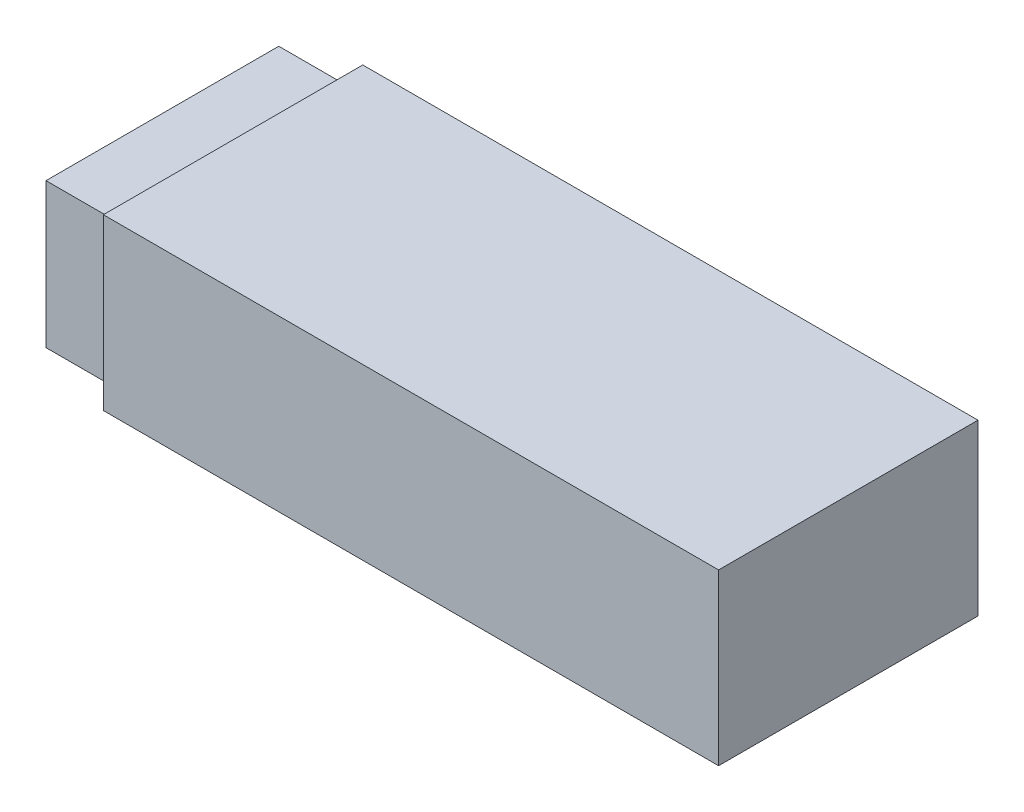
ISO-10303-21;
HEADER;
FILE_DESCRIPTION(('STEP AP214'),'2;1');
FILE_NAME('part.step','',(''),(''),'','','');
FILE_SCHEMA(('AUTOMOTIVE_DESIGN { 1 0 10303 214 1 1 1 1 }'));
ENDSEC;
DATA;
#1=APPLICATION_CONTEXT('core data for automotive mechanical design processes');
#2=APPLICATION_PROTOCOL_DEFINITION('international standard','automotive_design',2000,#1);
#3=PRODUCT_CONTEXT('',#1,'mechanical');
#4=PRODUCT('Part','Part','',(#3));
#5=PRODUCT_RELATED_PRODUCT_CATEGORY('part','',(#4));
#6=PRODUCT_DEFINITION_FORMATION('','',#4);
#7=PRODUCT_DEFINITION_CONTEXT('part definition',#1,'design');
#8=PRODUCT_DEFINITION('design','',#6,#7);
#9=PRODUCT_DEFINITION_SHAPE('','',#8);
#10=(LENGTH_UNIT() NAMED_UNIT(*) SI_UNIT(.MILLI.,.METRE.));
#11=(NAMED_UNIT(*) PLANE_ANGLE_UNIT() SI_UNIT($,.RADIAN.));
#12=(NAMED_UNIT(*) SI_UNIT($,.STERADIAN.) SOLID_ANGLE_UNIT());
#13=UNCERTAINTY_MEASURE_WITH_UNIT(LENGTH_MEASURE(1.E-05),#10,'distance_accuracy_value','');
#14=(GEOMETRIC_REPRESENTATION_CONTEXT(3) GLOBAL_UNCERTAINTY_ASSIGNED_CONTEXT((#13)) GLOBAL_UNIT_ASSIGNED_CONTEXT((#10,
#11,#12)) REPRESENTATION_CONTEXT('',''));
#15=CARTESIAN_POINT('',(0.,0.,0.));
#16=DIRECTION('',(0.,0.,1.));
#17=DIRECTION('',(1.,0.,0.));
#18=AXIS2_PLACEMENT_3D('',#15,#16,#17);
#19=CARTESIAN_POINT('',(57.2304529306441,5.10219609198077,217.892271057495));
#20=DIRECTION('',(0.,-1.,0.));
#21=DIRECTION('',(1.,0.,0.));
#22=AXIS2_PLACEMENT_3D('',#19,#20,#21);
#23=PLANE('',#22);
#24=DIRECTION('',(-1.,0.,0.));
#25=VECTOR('',#24,1.);
#26=CARTESIAN_POINT('',(57.2304529306441,5.10219609198077,202.292271057495));
#27=LINE('',#26,#25);
#28=CARTESIAN_POINT('',(57.2304529306441,5.10219609198077,202.292271057495));
#29=VERTEX_POINT('',#28);
#30=CARTESIAN_POINT('',(20.2304529306441,5.10219609198091,202.292271057495));
#31=VERTEX_POINT('',#30);
#32=EDGE_CURVE('E11',#29,#31,#27,.T.);
#33=ORIENTED_EDGE('',*,*,#32,.T.);
#34=DIRECTION('',(0.,0.,-1.));
#35=VECTOR('',#34,1.);
#36=CARTESIAN_POINT('',(20.2304529306441,5.10219609198091,217.892271057495));
#37=LINE('',#36,#35);
#38=CARTESIAN_POINT('',(20.2304529306441,5.10219609198091,217.892271057495));
#39=VERTEX_POINT('',#38);
#40=EDGE_CURVE('E36',#39,#31,#37,.T.);
#41=ORIENTED_EDGE('',*,*,#40,.F.);
#42=DIRECTION('',(-1.,0.,0.));
#43=VECTOR('',#42,1.);
#44=CARTESIAN_POINT('',(57.2304529306441,5.10219609198077,217.892271057495));
#45=LINE('',#44,#43);
#46=CARTESIAN_POINT('',(57.2304529306441,5.10219609198077,217.892271057495));
#47=VERTEX_POINT('',#46);
#48=EDGE_CURVE('E125',#47,#39,#45,.T.);
#49=ORIENTED_EDGE('',*,*,#48,.F.);
#50=DIRECTION('',(0.,0.,-1.));
#51=VECTOR('',#50,1.);
#52=CARTESIAN_POINT('',(57.2304529306441,5.10219609198077,217.892271057495));
#53=LINE('',#52,#51);
#54=EDGE_CURVE('E27',#47,#29,#53,.T.);
#55=ORIENTED_EDGE('',*,*,#54,.T.);
#56=EDGE_LOOP('',(#33,#41,#49,#55));
#57=FACE_BOUND('',#56,.T.);
#58=ADVANCED_FACE('F17',(#57),#23,.F.);
#59=CARTESIAN_POINT('',(20.2304529306441,5.10219609198077,217.892271057495));
#60=DIRECTION('',(1.,0.,0.));
#61=DIRECTION('',(0.,0.,1.));
#62=AXIS2_PLACEMENT_3D('',#59,#60,#61);
#63=PLANE('',#62);
#64=DIRECTION('',(0.,0.,-1.));
#65=VECTOR('',#64,1.);
#66=CARTESIAN_POINT('',(20.2304529306441,4.35219609198091,217.892271057495));
#67=LINE('',#66,#65);
#68=CARTESIAN_POINT('',(20.2304529306441,4.35219609198091,217.092271057495));
#69=VERTEX_POINT('',#68);
#70=CARTESIAN_POINT('',(20.2304529306441,4.35219609198092,203.092271057495));
#71=VERTEX_POINT('',#70);
#72=EDGE_CURVE('E111',#69,#71,#67,.T.);
#73=ORIENTED_EDGE('',*,*,#72,.F.);
#74=DIRECTION('',(0.,-1.,0.));
#75=VECTOR('',#74,1.);
#76=CARTESIAN_POINT('',(20.2304529306441,5.10219609198077,217.092271057495));
#77=LINE('',#76,#75);
#78=CARTESIAN_POINT('',(20.2304529306441,-4.34780390801909,217.092271057495));
#79=VERTEX_POINT('',#78);
#80=EDGE_CURVE('E133',#69,#79,#77,.T.);
#81=ORIENTED_EDGE('',*,*,#80,.T.);
#82=DIRECTION('',(0.,0.,1.));
#83=VECTOR('',#82,1.);
#84=CARTESIAN_POINT('',(20.2304529306441,-4.34780390801909,217.892271057495));
#85=LINE('',#84,#83);
#86=CARTESIAN_POINT('',(20.2304529306441,-4.34780390801909,203.092271057495));
#87=VERTEX_POINT('',#86);
#88=EDGE_CURVE('E86',#87,#79,#85,.T.);
#89=ORIENTED_EDGE('',*,*,#88,.F.);
#90=DIRECTION('',(0.,-1.,0.));
#91=VECTOR('',#90,1.);
#92=CARTESIAN_POINT('',(20.2304529306441,5.10219609198077,203.092271057495));
#93=LINE('',#92,#91);
#94=EDGE_CURVE('E92',#71,#87,#93,.T.);
#95=ORIENTED_EDGE('',*,*,#94,.F.);
#96=EDGE_LOOP('',(#73,#81,#89,#95));
#97=FACE_BOUND('',#96,.T.);
#98=DIRECTION('',(0.,-1.,0.));
#99=VECTOR('',#98,1.);
#100=CARTESIAN_POINT('',(20.2304529306441,5.10219609198077,202.292271057495));
#101=LINE('',#100,#99);
#102=CARTESIAN_POINT('',(20.2304529306441,-5.09780390801923,202.292271057495));
#103=VERTEX_POINT('',#102);
#104=EDGE_CURVE('E131',#31,#103,#101,.T.);
#105=ORIENTED_EDGE('',*,*,#104,.T.);
#106=DIRECTION('',(0.,0.,-1.));
#107=VECTOR('',#106,1.);
#108=CARTESIAN_POINT('',(20.2304529306441,-5.09780390801923,217.892271057495));
#109=LINE('',#108,#107);
#110=CARTESIAN_POINT('',(20.2304529306441,-5.09780390801923,217.892271057495));
#111=VERTEX_POINT('',#110);
#112=EDGE_CURVE('E120',#111,#103,#109,.T.);
#113=ORIENTED_EDGE('',*,*,#112,.F.);
#114=DIRECTION('',(0.,-1.,0.));
#115=VECTOR('',#114,1.);
#116=CARTESIAN_POINT('',(20.2304529306441,5.10219609198077,217.892271057495));
#117=LINE('',#116,#115);
#118=EDGE_CURVE('E123',#39,#111,#117,.T.);
#119=ORIENTED_EDGE('',*,*,#118,.F.);
#120=ORIENTED_EDGE('',*,*,#40,.T.);
#121=EDGE_LOOP('',(#105,#113,#119,#120));
#122=FACE_BOUND('',#121,.T.);
#123=ADVANCED_FACE('F150',(#97,#122),#63,.F.);
#124=CARTESIAN_POINT('',(20.2304529306441,-5.09780390801909,217.892271057495));
#125=DIRECTION('',(0.,1.,0.));
#126=DIRECTION('',(-1.,0.,0.));
#127=AXIS2_PLACEMENT_3D('',#124,#125,#126);
#128=PLANE('',#127);
#129=DIRECTION('',(1.,0.,0.));
#130=VECTOR('',#129,1.);
#131=CARTESIAN_POINT('',(20.2304529306441,-5.09780390801909,202.292271057495));
#132=LINE('',#131,#130);
#133=CARTESIAN_POINT('',(57.2304529306441,-5.09780390801923,202.292271057495));
#134=VERTEX_POINT('',#133);
#135=EDGE_CURVE('E126',#103,#134,#132,.T.);
#136=ORIENTED_EDGE('',*,*,#135,.T.);
#137=DIRECTION('',(0.,0.,-1.));
#138=VECTOR('',#137,1.);
#139=CARTESIAN_POINT('',(57.2304529306441,-5.09780390801923,217.892271057495));
#140=LINE('',#139,#138);
#141=CARTESIAN_POINT('',(57.2304529306441,-5.09780390801923,217.892271057495));
#142=VERTEX_POINT('',#141);
#143=EDGE_CURVE('E121',#142,#134,#140,.T.);
#144=ORIENTED_EDGE('',*,*,#143,.F.);
#145=DIRECTION('',(1.,0.,0.));
#146=VECTOR('',#145,1.);
#147=CARTESIAN_POINT('',(20.2304529306441,-5.09780390801909,217.892271057495));
#148=LINE('',#147,#146);
#149=EDGE_CURVE('E116',#111,#142,#148,.T.);
#150=ORIENTED_EDGE('',*,*,#149,.F.);
#151=ORIENTED_EDGE('',*,*,#112,.T.);
#152=EDGE_LOOP('',(#136,#144,#150,#151));
#153=FACE_BOUND('',#152,.T.);
#154=ADVANCED_FACE('F155',(#153),#128,.F.);
#155=CARTESIAN_POINT('',(57.2304529306441,-5.09780390801923,217.892271057495));
#156=DIRECTION('',(-1.,0.,0.));
#157=DIRECTION('',(0.,0.,-1.));
#158=AXIS2_PLACEMENT_3D('',#155,#156,#157);
#159=PLANE('',#158);
#160=DIRECTION('',(0.,1.,0.));
#161=VECTOR('',#160,1.);
#162=CARTESIAN_POINT('',(57.2304529306441,-5.09780390801923,202.292271057495));
#163=LINE('',#162,#161);
#164=EDGE_CURVE('E117',#134,#29,#163,.T.);
#165=ORIENTED_EDGE('',*,*,#164,.T.);
#166=ORIENTED_EDGE('',*,*,#54,.F.);
#167=DIRECTION('',(0.,1.,0.));
#168=VECTOR('',#167,1.);
#169=CARTESIAN_POINT('',(57.2304529306441,-5.09780390801923,217.892271057495));
#170=LINE('',#169,#168);
#171=EDGE_CURVE('E113',#142,#47,#170,.T.);
#172=ORIENTED_EDGE('',*,*,#171,.F.);
#173=ORIENTED_EDGE('',*,*,#143,.T.);
#174=EDGE_LOOP('',(#165,#166,#172,#173));
#175=FACE_BOUND('',#174,.T.);
#176=ADVANCED_FACE('F158',(#175),#159,.F.);
#177=CARTESIAN_POINT('',(20.2304529306441,5.10219609198091,217.892271057495));
#178=DIRECTION('',(0.,0.,1.));
#179=DIRECTION('',(0.,-1.,0.));
#180=AXIS2_PLACEMENT_3D('',#177,#178,#179);
#181=PLANE('',#180);
#182=ORIENTED_EDGE('',*,*,#48,.T.);
#183=ORIENTED_EDGE('',*,*,#118,.T.);
#184=ORIENTED_EDGE('',*,*,#149,.T.);
#185=ORIENTED_EDGE('',*,*,#171,.T.);
#186=EDGE_LOOP('',(#182,#183,#184,#185));
#187=FACE_BOUND('',#186,.T.);
#188=ADVANCED_FACE('F143',(#187),#181,.T.);
#189=CARTESIAN_POINT('',(20.2304529306441,5.10219609198091,202.292271057495));
#190=DIRECTION('',(0.,0.,1.));
#191=DIRECTION('',(0.,-1.,0.));
#192=AXIS2_PLACEMENT_3D('',#189,#190,#191);
#193=PLANE('',#192);
#194=ORIENTED_EDGE('',*,*,#32,.F.);
#195=ORIENTED_EDGE('',*,*,#164,.F.);
#196=ORIENTED_EDGE('',*,*,#135,.F.);
#197=ORIENTED_EDGE('',*,*,#104,.F.);
#198=EDGE_LOOP('',(#194,#195,#196,#197));
#199=FACE_BOUND('',#198,.T.);
#200=ADVANCED_FACE('F160',(#199),#193,.F.);
#201=CARTESIAN_POINT('',(57.2304529306441,4.35219609198077,217.092271057495));
#202=DIRECTION('',(0.,-1.,0.));
#203=DIRECTION('',(1.,0.,0.));
#204=AXIS2_PLACEMENT_3D('',#201,#202,#203);
#205=PLANE('',#204);
#206=DIRECTION('',(-1.,0.,0.));
#207=VECTOR('',#206,1.);
#208=CARTESIAN_POINT('',(57.2304529306441,4.35219609198077,217.092271057495));
#209=LINE('',#208,#207);
#210=CARTESIAN_POINT('',(15.9804529306441,4.35219609198092,217.092271057495));
#211=VERTEX_POINT('',#210);
#212=EDGE_CURVE('E98',#69,#211,#209,.T.);
#213=ORIENTED_EDGE('',*,*,#212,.F.);
#214=ORIENTED_EDGE('',*,*,#72,.T.);
#215=DIRECTION('',(-1.,0.,0.));
#216=VECTOR('',#215,1.);
#217=CARTESIAN_POINT('',(57.2304529306441,4.35219609198077,203.092271057495));
#218=LINE('',#217,#216);
#219=CARTESIAN_POINT('',(15.9804529306441,4.35219609198092,203.092271057495));
#220=VERTEX_POINT('',#219);
#221=EDGE_CURVE('E107',#71,#220,#218,.T.);
#222=ORIENTED_EDGE('',*,*,#221,.T.);
#223=DIRECTION('',(0.,0.,-1.));
#224=VECTOR('',#223,1.);
#225=CARTESIAN_POINT('',(15.9804529306441,4.35219609198092,217.092271057495));
#226=LINE('',#225,#224);
#227=EDGE_CURVE('E108',#211,#220,#226,.T.);
#228=ORIENTED_EDGE('',*,*,#227,.F.);
#229=EDGE_LOOP('',(#213,#214,#222,#228));
#230=FACE_BOUND('',#229,.T.);
#231=ADVANCED_FACE('F162',(#230),#205,.F.);
#232=CARTESIAN_POINT('',(15.9804529306441,-4.34780390801908,217.092271057495));
#233=DIRECTION('',(0.,1.,0.));
#234=DIRECTION('',(-1.,0.,0.));
#235=AXIS2_PLACEMENT_3D('',#232,#233,#234);
#236=PLANE('',#235);
#237=DIRECTION('',(1.,0.,0.));
#238=VECTOR('',#237,1.);
#239=CARTESIAN_POINT('',(15.9804529306441,-4.34780390801908,203.092271057495));
#240=LINE('',#239,#238);
#241=CARTESIAN_POINT('',(15.9804529306441,-4.34780390801923,203.092271057495));
#242=VERTEX_POINT('',#241);
#243=EDGE_CURVE('E105',#242,#87,#240,.T.);
#244=ORIENTED_EDGE('',*,*,#243,.T.);
#245=ORIENTED_EDGE('',*,*,#88,.T.);
#246=DIRECTION('',(1.,0.,0.));
#247=VECTOR('',#246,1.);
#248=CARTESIAN_POINT('',(15.9804529306441,-4.34780390801908,217.092271057495));
#249=LINE('',#248,#247);
#250=CARTESIAN_POINT('',(15.9804529306441,-4.34780390801923,217.092271057495));
#251=VERTEX_POINT('',#250);
#252=EDGE_CURVE('E83',#251,#79,#249,.T.);
#253=ORIENTED_EDGE('',*,*,#252,.F.);
#254=DIRECTION('',(0.,0.,-1.));
#255=VECTOR('',#254,1.);
#256=CARTESIAN_POINT('',(15.9804529306441,-4.34780390801923,217.092271057495));
#257=LINE('',#256,#255);
#258=EDGE_CURVE('E80',#251,#242,#257,.T.);
#259=ORIENTED_EDGE('',*,*,#258,.T.);
#260=EDGE_LOOP('',(#244,#245,#253,#259));
#261=FACE_BOUND('',#260,.T.);
#262=ADVANCED_FACE('F84',(#261),#236,.F.);
#263=CARTESIAN_POINT('',(57.2304529306441,4.35219609198077,217.092271057495));
#264=DIRECTION('',(0.,0.,1.));
#265=DIRECTION('',(0.,-1.,0.));
#266=AXIS2_PLACEMENT_3D('',#263,#264,#265);
#267=PLANE('',#266);
#268=ORIENTED_EDGE('',*,*,#80,.F.);
#269=ORIENTED_EDGE('',*,*,#212,.T.);
#270=DIRECTION('',(0.,-1.,0.));
#271=VECTOR('',#270,1.);
#272=CARTESIAN_POINT('',(15.9804529306441,4.35219609198077,217.092271057495));
#273=LINE('',#272,#271);
#274=EDGE_CURVE('E91',#211,#251,#273,.T.);
#275=ORIENTED_EDGE('',*,*,#274,.T.);
#276=ORIENTED_EDGE('',*,*,#252,.T.);
#277=EDGE_LOOP('',(#268,#269,#275,#276));
#278=FACE_BOUND('',#277,.T.);
#279=ADVANCED_FACE('F101',(#278),#267,.T.);
#280=CARTESIAN_POINT('',(57.2304529306441,4.35219609198077,203.092271057495));
#281=DIRECTION('',(0.,0.,1.));
#282=DIRECTION('',(0.,-1.,0.));
#283=AXIS2_PLACEMENT_3D('',#280,#281,#282);
#284=PLANE('',#283);
#285=ORIENTED_EDGE('',*,*,#221,.F.);
#286=ORIENTED_EDGE('',*,*,#94,.T.);
#287=ORIENTED_EDGE('',*,*,#243,.F.);
#288=DIRECTION('',(0.,-1.,0.));
#289=VECTOR('',#288,1.);
#290=CARTESIAN_POINT('',(15.9804529306441,4.35219609198077,203.092271057495));
#291=LINE('',#290,#289);
#292=EDGE_CURVE('E21',#220,#242,#291,.T.);
#293=ORIENTED_EDGE('',*,*,#292,.F.);
#294=EDGE_LOOP('',(#285,#286,#287,#293));
#295=FACE_BOUND('',#294,.T.);
#296=ADVANCED_FACE('F226',(#295),#284,.F.);
#297=CARTESIAN_POINT('',(15.9804529306441,4.35219609198077,217.092271057495));
#298=DIRECTION('',(1.,0.,0.));
#299=DIRECTION('',(0.,0.,1.));
#300=AXIS2_PLACEMENT_3D('',#297,#298,#299);
#301=PLANE('',#300);
#302=ORIENTED_EDGE('',*,*,#292,.T.);
#303=ORIENTED_EDGE('',*,*,#258,.F.);
#304=ORIENTED_EDGE('',*,*,#274,.F.);
#305=ORIENTED_EDGE('',*,*,#227,.T.);
#306=EDGE_LOOP('',(#302,#303,#304,#305));
#307=FACE_BOUND('',#306,.T.);
#308=ADVANCED_FACE('F19',(#307),#301,.F.);
#309=CLOSED_SHELL('',(#58,#123,#154,#176,#188,#200,#231,#262,#279,#296,#308));
#310=MANIFOLD_SOLID_BREP('B1',#309);
#311=ADVANCED_BREP_SHAPE_REPRESENTATION('',(#18,#310),#14);
#312=SHAPE_DEFINITION_REPRESENTATION(#9,#311);
ENDSEC;
END-ISO-10303-21;
